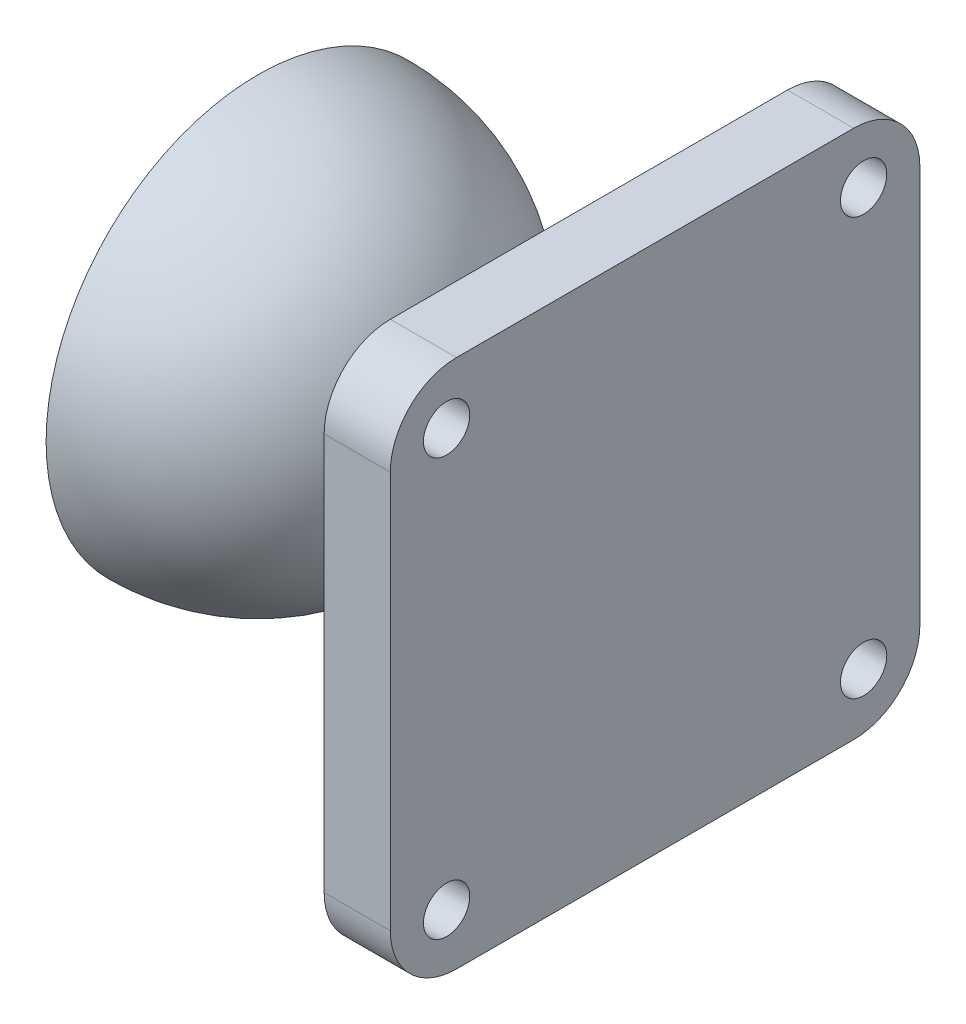
ISO-10303-21;
HEADER;
FILE_DESCRIPTION(('STEP AP214'),'2;1');
FILE_NAME('part.step','',(''),(''),'','','');
FILE_SCHEMA(('AUTOMOTIVE_DESIGN { 1 0 10303 214 1 1 1 1 }'));
ENDSEC;
DATA;
#1=APPLICATION_CONTEXT('core data for automotive mechanical design processes');
#2=APPLICATION_PROTOCOL_DEFINITION('international standard','automotive_design',2000,#1);
#3=PRODUCT_CONTEXT('',#1,'mechanical');
#4=PRODUCT('Part','Part','',(#3));
#5=PRODUCT_RELATED_PRODUCT_CATEGORY('part','',(#4));
#6=PRODUCT_DEFINITION_FORMATION('','',#4);
#7=PRODUCT_DEFINITION_CONTEXT('part definition',#1,'design');
#8=PRODUCT_DEFINITION('design','',#6,#7);
#9=PRODUCT_DEFINITION_SHAPE('','',#8);
#10=(LENGTH_UNIT() NAMED_UNIT(*) SI_UNIT(.MILLI.,.METRE.));
#11=(NAMED_UNIT(*) PLANE_ANGLE_UNIT() SI_UNIT($,.RADIAN.));
#12=(NAMED_UNIT(*) SI_UNIT($,.STERADIAN.) SOLID_ANGLE_UNIT());
#13=UNCERTAINTY_MEASURE_WITH_UNIT(LENGTH_MEASURE(1.E-05),#10,'distance_accuracy_value','');
#14=(GEOMETRIC_REPRESENTATION_CONTEXT(3) GLOBAL_UNCERTAINTY_ASSIGNED_CONTEXT((#13)) GLOBAL_UNIT_ASSIGNED_CONTEXT((#10,
#11,#12)) REPRESENTATION_CONTEXT('',''));
#15=CARTESIAN_POINT('',(0.,0.,0.));
#16=DIRECTION('',(0.,0.,1.));
#17=DIRECTION('',(1.,0.,0.));
#18=AXIS2_PLACEMENT_3D('',#15,#16,#17);
#19=CARTESIAN_POINT('',(0.,0.,0.));
#20=DIRECTION('',(-1.,0.,0.));
#21=DIRECTION('',(0.,1.,0.));
#22=AXIS2_PLACEMENT_3D('',#19,#20,#21);
#23=SPHERICAL_SURFACE('',#22,16.);
#24=CARTESIAN_POINT('',(0.,0.,0.));
#25=DIRECTION('',(-1.,0.,0.));
#26=DIRECTION('',(0.,0.,1.));
#27=AXIS2_PLACEMENT_3D('',#24,#25,#26);
#28=CIRCLE('',#27,16.);
#29=CARTESIAN_POINT('',(0.,0.,16.));
#30=VERTEX_POINT('',#29);
#31=EDGE_CURVE('E155',#30,#30,#28,.T.);
#32=ORIENTED_EDGE('',*,*,#31,.F.);
#33=EDGE_LOOP('',(#32));
#34=FACE_BOUND('',#33,.T.);
#35=CARTESIAN_POINT('',(14.1332940251026,0.,0.));
#36=DIRECTION('',(-1.,0.,0.));
#37=DIRECTION('',(0.,0.,1.));
#38=AXIS2_PLACEMENT_3D('',#35,#36,#37);
#39=CIRCLE('',#38,7.5);
#40=CARTESIAN_POINT('',(14.1332940251026,0.,-7.5));
#41=VERTEX_POINT('',#40);
#42=EDGE_CURVE('E158',#41,#41,#39,.F.);
#43=ORIENTED_EDGE('',*,*,#42,.F.);
#44=EDGE_LOOP('',(#43));
#45=FACE_BOUND('',#44,.T.);
#46=ADVANCED_FACE('F47',(#34,#45),#23,.T.);
#47=CARTESIAN_POINT('',(0.,15.,0.));
#48=DIRECTION('',(-1.,0.,0.));
#49=DIRECTION('',(0.,0.,1.));
#50=AXIS2_PLACEMENT_3D('',#47,#48,#49);
#51=PLANE('',#50);
#52=ORIENTED_EDGE('',*,*,#31,.T.);
#53=EDGE_LOOP('',(#52));
#54=FACE_BOUND('',#53,.T.);
#55=CARTESIAN_POINT('',(0.,0.,0.));
#56=DIRECTION('',(-1.,0.,0.));
#57=DIRECTION('',(0.,0.,1.));
#58=AXIS2_PLACEMENT_3D('',#55,#56,#57);
#59=CIRCLE('',#58,15.);
#60=CARTESIAN_POINT('',(0.,0.,15.));
#61=VERTEX_POINT('',#60);
#62=EDGE_CURVE('E151',#61,#61,#59,.T.);
#63=ORIENTED_EDGE('',*,*,#62,.F.);
#64=EDGE_LOOP('',(#63));
#65=FACE_BOUND('',#64,.T.);
#66=ADVANCED_FACE('F252',(#54,#65),#51,.T.);
#67=CARTESIAN_POINT('',(0.,0.,0.));
#68=DIRECTION('',(-1.,0.,0.));
#69=DIRECTION('',(0.,1.,0.));
#70=AXIS2_PLACEMENT_3D('',#67,#68,#69);
#71=SPHERICAL_SURFACE('',#70,15.);
#72=ORIENTED_EDGE('',*,*,#62,.T.);
#73=EDGE_LOOP('',(#72));
#74=FACE_BOUND('',#73,.T.);
#75=ADVANCED_FACE('F260',(#74),#71,.F.);
#76=CARTESIAN_POINT('',(-16.001,0.,0.));
#77=DIRECTION('',(1.,0.,0.));
#78=DIRECTION('',(0.,0.,-1.));
#79=AXIS2_PLACEMENT_3D('',#76,#77,#78);
#80=CYLINDRICAL_SURFACE('',#79,7.5);
#81=CARTESIAN_POINT('',(25.,0.,0.));
#82=DIRECTION('',(-1.,0.,0.));
#83=DIRECTION('',(0.,0.,1.));
#84=AXIS2_PLACEMENT_3D('',#81,#82,#83);
#85=CIRCLE('',#84,7.5);
#86=CARTESIAN_POINT('',(25.,0.,-7.5));
#87=VERTEX_POINT('',#86);
#88=EDGE_CURVE('E148',#87,#87,#85,.T.);
#89=CARTESIAN_POINT('',(25.,0.,-7.5));
#90=CARTESIAN_POINT('',(24.8868051460948,0.,-7.5));
#91=CARTESIAN_POINT('',(24.7736102921896,0.,-7.5));
#92=CARTESIAN_POINT('',(24.5472205843793,0.,-7.5));
#93=CARTESIAN_POINT('',(24.4340257304741,0.,-7.5));
#94=CARTESIAN_POINT('',(24.2076360226637,0.,-7.5));
#95=CARTESIAN_POINT('',(24.0944411687585,0.,-7.5));
#96=CARTESIAN_POINT('',(23.8680514609482,0.,-7.5));
#97=CARTESIAN_POINT('',(23.754856607043,0.,-7.5));
#98=CARTESIAN_POINT('',(23.5284668992326,0.,-7.5));
#99=CARTESIAN_POINT('',(23.4152720453275,0.,-7.5));
#100=CARTESIAN_POINT('',(23.1888823375171,0.,-7.5));
#101=CARTESIAN_POINT('',(23.0756874836119,0.,-7.5));
#102=CARTESIAN_POINT('',(22.8492977758015,0.,-7.5));
#103=CARTESIAN_POINT('',(22.7361029218964,0.,-7.5));
#104=CARTESIAN_POINT('',(22.509713214086,0.,-7.5));
#105=CARTESIAN_POINT('',(22.3965183601808,0.,-7.5));
#106=CARTESIAN_POINT('',(22.1701286523705,0.,-7.5));
#107=CARTESIAN_POINT('',(22.0569337984653,0.,-7.5));
#108=CARTESIAN_POINT('',(21.8305440906549,0.,-7.5));
#109=CARTESIAN_POINT('',(21.7173492367497,0.,-7.5));
#110=CARTESIAN_POINT('',(21.4909595289394,0.,-7.5));
#111=CARTESIAN_POINT('',(21.3777646750342,0.,-7.5));
#112=CARTESIAN_POINT('',(21.1513749672238,0.,-7.5));
#113=CARTESIAN_POINT('',(21.0381801133186,0.,-7.5));
#114=CARTESIAN_POINT('',(20.8117904055083,0.,-7.5));
#115=CARTESIAN_POINT('',(20.6985955516031,0.,-7.5));
#116=CARTESIAN_POINT('',(20.4722058437927,0.,-7.5));
#117=CARTESIAN_POINT('',(20.3590109898876,0.,-7.5));
#118=CARTESIAN_POINT('',(20.1326212820772,0.,-7.5));
#119=CARTESIAN_POINT('',(20.019426428172,0.,-7.5));
#120=CARTESIAN_POINT('',(19.7930367203616,0.,-7.5));
#121=CARTESIAN_POINT('',(19.6798418664565,0.,-7.5));
#122=CARTESIAN_POINT('',(19.4534521586461,0.,-7.5));
#123=CARTESIAN_POINT('',(19.3402573047409,0.,-7.5));
#124=CARTESIAN_POINT('',(19.1138675969306,0.,-7.5));
#125=CARTESIAN_POINT('',(19.0006727430254,0.,-7.5));
#126=CARTESIAN_POINT('',(18.774283035215,0.,-7.5));
#127=CARTESIAN_POINT('',(18.6610881813098,0.,-7.5));
#128=CARTESIAN_POINT('',(18.4346984734995,0.,-7.5));
#129=CARTESIAN_POINT('',(18.3215036195943,0.,-7.5));
#130=CARTESIAN_POINT('',(18.0951139117839,0.,-7.5));
#131=CARTESIAN_POINT('',(17.9819190578787,0.,-7.5));
#132=CARTESIAN_POINT('',(17.7555293500684,0.,-7.5));
#133=CARTESIAN_POINT('',(17.6423344961632,0.,-7.5));
#134=CARTESIAN_POINT('',(17.4159447883528,0.,-7.5));
#135=CARTESIAN_POINT('',(17.3027499344476,0.,-7.5));
#136=CARTESIAN_POINT('',(17.0763602266373,0.,-7.5));
#137=CARTESIAN_POINT('',(16.9631653727321,0.,-7.5));
#138=CARTESIAN_POINT('',(16.7367756649217,0.,-7.5));
#139=CARTESIAN_POINT('',(16.6235808110166,0.,-7.5));
#140=CARTESIAN_POINT('',(16.3971911032062,0.,-7.5));
#141=CARTESIAN_POINT('',(16.283996249301,0.,-7.5));
#142=CARTESIAN_POINT('',(16.0576065414906,0.,-7.5));
#143=CARTESIAN_POINT('',(15.9444116875855,0.,-7.5));
#144=CARTESIAN_POINT('',(15.7180219797751,0.,-7.5));
#145=CARTESIAN_POINT('',(15.6048271258699,0.,-7.5));
#146=CARTESIAN_POINT('',(15.3784374180596,0.,-7.5));
#147=CARTESIAN_POINT('',(15.2652425641544,0.,-7.5));
#148=CARTESIAN_POINT('',(15.038852856344,0.,-7.5));
#149=CARTESIAN_POINT('',(14.9256580024388,0.,-7.5));
#150=CARTESIAN_POINT('',(14.6992682946285,0.,-7.5));
#151=CARTESIAN_POINT('',(14.5860734407233,0.,-7.5));
#152=CARTESIAN_POINT('',(14.3596837329129,0.,-7.5));
#153=CARTESIAN_POINT('',(14.2464888790077,0.,-7.5));
#154=CARTESIAN_POINT('',(14.1332940251026,0.,-7.5));
#155=B_SPLINE_CURVE_WITH_KNOTS('',3,(#89,#90,#91,#92,#93,#94,#95,#96,#97,#98,#99,#100,#101,#102,
#103,#104,#105,#106,#107,#108,#109,#110,#111,#112,#113,#114,#115,#116,#117,#118,#119,#120,#121,
#122,#123,#124,#125,#126,#127,#128,#129,#130,#131,#132,#133,#134,#135,#136,#137,#138,#139,#140,
#141,#142,#143,#144,#145,#146,#147,#148,#149,#150,#151,#152,#153,#154),.UNSPECIFIED.,.F.,.F.,(4,
2,2,2,2,2,2,2,2,2,2,2,2,2,2,2,2,2,2,2,2,2,2,2,2,2,2,2,2,2,2,2,4),(0.,0.339584561715546,
0.679169123431092,1.01875368514664,1.35833824686218,1.69792280857772,2.03750737029327,
2.37709193200882,2.71667649372436,3.05626105543991,3.39584561715545,3.735430178871,
4.07501474058654,4.41459930230208,4.75418386401763,5.09376842573318,5.43335298744872,
5.77293754916427,6.11252211087981,6.45210667259536,6.79169123431091,7.13127579602645,
7.47086035774199,7.81044491945754,8.15002948117308,8.48961404288863,8.82919860460418,
9.16878316631972,9.50836772803526,9.84795228975081,10.1875368514663,10.5271214131819,
10.8667059748974),.UNSPECIFIED.);
#156=EDGE_CURVE('BSEAM355',#87,#41,#155,.T.);
#157=ORIENTED_EDGE('',*,*,#88,.T.);
#158=ORIENTED_EDGE('',*,*,#42,.T.);
#159=ORIENTED_EDGE('',*,*,#156,.T.);
#160=ORIENTED_EDGE('',*,*,#156,.F.);
#161=EDGE_LOOP('',(#157,#159,#158,#160));
#162=FACE_BOUND('',#161,.T.);
#163=ADVANCED_FACE('F355',(#162),#80,.T.);
#164=CARTESIAN_POINT('',(30.,-20.,-20.));
#165=DIRECTION('',(0.,0.,1.));
#166=DIRECTION('',(1.,0.,0.));
#167=AXIS2_PLACEMENT_3D('',#164,#165,#166);
#168=PLANE('',#167);
#169=DIRECTION('',(0.,1.,0.));
#170=VECTOR('',#169,1.);
#171=CARTESIAN_POINT('',(30.,-20.,-20.));
#172=LINE('',#171,#170);
#173=CARTESIAN_POINT('',(30.,-15.,-20.));
#174=VERTEX_POINT('',#173);
#175=CARTESIAN_POINT('',(30.,15.,-20.));
#176=VERTEX_POINT('',#175);
#177=EDGE_CURVE('E142',#174,#176,#172,.T.);
#178=ORIENTED_EDGE('',*,*,#177,.F.);
#179=DIRECTION('',(-1.,0.,0.));
#180=VECTOR('',#179,1.);
#181=CARTESIAN_POINT('',(30.,-15.,-20.));
#182=LINE('',#181,#180);
#183=CARTESIAN_POINT('',(25.,-15.,-20.));
#184=VERTEX_POINT('',#183);
#185=EDGE_CURVE('E11',#174,#184,#182,.T.);
#186=ORIENTED_EDGE('',*,*,#185,.T.);
#187=DIRECTION('',(0.,1.,0.));
#188=VECTOR('',#187,1.);
#189=CARTESIAN_POINT('',(25.,-20.,-20.));
#190=LINE('',#189,#188);
#191=CARTESIAN_POINT('',(25.,15.,-20.));
#192=VERTEX_POINT('',#191);
#193=EDGE_CURVE('E144',#184,#192,#190,.T.);
#194=ORIENTED_EDGE('',*,*,#193,.T.);
#195=DIRECTION('',(-1.,0.,0.));
#196=VECTOR('',#195,1.);
#197=CARTESIAN_POINT('',(30.,15.,-20.));
#198=LINE('',#197,#196);
#199=EDGE_CURVE('E55',#192,#176,#198,.F.);
#200=ORIENTED_EDGE('',*,*,#199,.T.);
#201=EDGE_LOOP('',(#178,#186,#194,#200));
#202=FACE_BOUND('',#201,.T.);
#203=ADVANCED_FACE('F184',(#202),#168,.F.);
#204=CARTESIAN_POINT('',(30.,20.,20.));
#205=DIRECTION('',(0.,-1.,0.));
#206=DIRECTION('',(0.,0.,-1.));
#207=AXIS2_PLACEMENT_3D('',#204,#205,#206);
#208=PLANE('',#207);
#209=DIRECTION('',(0.,0.,1.));
#210=VECTOR('',#209,1.);
#211=CARTESIAN_POINT('',(25.,20.,20.));
#212=LINE('',#211,#210);
#213=CARTESIAN_POINT('',(25.,20.,-15.));
#214=VERTEX_POINT('',#213);
#215=CARTESIAN_POINT('',(25.,20.,15.));
#216=VERTEX_POINT('',#215);
#217=EDGE_CURVE('E140',#214,#216,#212,.T.);
#218=ORIENTED_EDGE('',*,*,#217,.T.);
#219=DIRECTION('',(-1.,0.,0.));
#220=VECTOR('',#219,1.);
#221=CARTESIAN_POINT('',(30.,20.,15.));
#222=LINE('',#221,#220);
#223=CARTESIAN_POINT('',(30.,20.,15.));
#224=VERTEX_POINT('',#223);
#225=EDGE_CURVE('E119',#216,#224,#222,.F.);
#226=ORIENTED_EDGE('',*,*,#225,.T.);
#227=DIRECTION('',(0.,0.,1.));
#228=VECTOR('',#227,1.);
#229=CARTESIAN_POINT('',(30.,20.,20.));
#230=LINE('',#229,#228);
#231=CARTESIAN_POINT('',(30.,20.,-15.));
#232=VERTEX_POINT('',#231);
#233=EDGE_CURVE('E193',#232,#224,#230,.T.);
#234=ORIENTED_EDGE('',*,*,#233,.F.);
#235=DIRECTION('',(-1.,0.,0.));
#236=VECTOR('',#235,1.);
#237=CARTESIAN_POINT('',(30.,20.,-15.));
#238=LINE('',#237,#236);
#239=EDGE_CURVE('E124',#232,#214,#238,.T.);
#240=ORIENTED_EDGE('',*,*,#239,.T.);
#241=EDGE_LOOP('',(#218,#226,#234,#240));
#242=FACE_BOUND('',#241,.T.);
#243=ADVANCED_FACE('F197',(#242),#208,.F.);
#244=CARTESIAN_POINT('',(30.,-20.,20.));
#245=DIRECTION('',(0.,0.,-1.));
#246=DIRECTION('',(-1.,0.,0.));
#247=AXIS2_PLACEMENT_3D('',#244,#245,#246);
#248=PLANE('',#247);
#249=DIRECTION('',(0.,-1.,0.));
#250=VECTOR('',#249,1.);
#251=CARTESIAN_POINT('',(30.,-20.,20.));
#252=LINE('',#251,#250);
#253=CARTESIAN_POINT('',(30.,15.,20.));
#254=VERTEX_POINT('',#253);
#255=CARTESIAN_POINT('',(30.,-15.,20.));
#256=VERTEX_POINT('',#255);
#257=EDGE_CURVE('E133',#254,#256,#252,.T.);
#258=ORIENTED_EDGE('',*,*,#257,.F.);
#259=DIRECTION('',(-1.,0.,0.));
#260=VECTOR('',#259,1.);
#261=CARTESIAN_POINT('',(30.,15.,20.));
#262=LINE('',#261,#260);
#263=CARTESIAN_POINT('',(25.,15.,20.));
#264=VERTEX_POINT('',#263);
#265=EDGE_CURVE('E118',#254,#264,#262,.T.);
#266=ORIENTED_EDGE('',*,*,#265,.T.);
#267=DIRECTION('',(0.,-1.,0.));
#268=VECTOR('',#267,1.);
#269=CARTESIAN_POINT('',(25.,-20.,20.));
#270=LINE('',#269,#268);
#271=CARTESIAN_POINT('',(25.,-15.,20.));
#272=VERTEX_POINT('',#271);
#273=EDGE_CURVE('E131',#264,#272,#270,.T.);
#274=ORIENTED_EDGE('',*,*,#273,.T.);
#275=DIRECTION('',(-1.,0.,0.));
#276=VECTOR('',#275,1.);
#277=CARTESIAN_POINT('',(30.,-15.,20.));
#278=LINE('',#277,#276);
#279=EDGE_CURVE('E135',#272,#256,#278,.F.);
#280=ORIENTED_EDGE('',*,*,#279,.T.);
#281=EDGE_LOOP('',(#258,#266,#274,#280));
#282=FACE_BOUND('',#281,.T.);
#283=ADVANCED_FACE('F130',(#282),#248,.F.);
#284=CARTESIAN_POINT('',(30.,-20.,20.));
#285=DIRECTION('',(0.,1.,0.));
#286=DIRECTION('',(0.,0.,1.));
#287=AXIS2_PLACEMENT_3D('',#284,#285,#286);
#288=PLANE('',#287);
#289=DIRECTION('',(0.,0.,-1.));
#290=VECTOR('',#289,1.);
#291=CARTESIAN_POINT('',(30.,-20.,20.));
#292=LINE('',#291,#290);
#293=CARTESIAN_POINT('',(30.,-20.,15.));
#294=VERTEX_POINT('',#293);
#295=CARTESIAN_POINT('',(30.,-20.,-15.));
#296=VERTEX_POINT('',#295);
#297=EDGE_CURVE('E152',#294,#296,#292,.T.);
#298=ORIENTED_EDGE('',*,*,#297,.F.);
#299=DIRECTION('',(-1.,0.,0.));
#300=VECTOR('',#299,1.);
#301=CARTESIAN_POINT('',(30.,-20.,15.));
#302=LINE('',#301,#300);
#303=CARTESIAN_POINT('',(25.,-20.,15.));
#304=VERTEX_POINT('',#303);
#305=EDGE_CURVE('E177',#294,#304,#302,.T.);
#306=ORIENTED_EDGE('',*,*,#305,.T.);
#307=DIRECTION('',(0.,0.,-1.));
#308=VECTOR('',#307,1.);
#309=CARTESIAN_POINT('',(25.,-20.,20.));
#310=LINE('',#309,#308);
#311=CARTESIAN_POINT('',(25.,-20.,-15.));
#312=VERTEX_POINT('',#311);
#313=EDGE_CURVE('E139',#304,#312,#310,.T.);
#314=ORIENTED_EDGE('',*,*,#313,.T.);
#315=DIRECTION('',(-1.,0.,0.));
#316=VECTOR('',#315,1.);
#317=CARTESIAN_POINT('',(30.,-20.,-15.));
#318=LINE('',#317,#316);
#319=EDGE_CURVE('E62',#312,#296,#318,.F.);
#320=ORIENTED_EDGE('',*,*,#319,.T.);
#321=EDGE_LOOP('',(#298,#306,#314,#320));
#322=FACE_BOUND('',#321,.T.);
#323=ADVANCED_FACE('F231',(#322),#288,.F.);
#324=CARTESIAN_POINT('',(30.,0.,0.));
#325=DIRECTION('',(-1.,0.,0.));
#326=DIRECTION('',(0.,0.,1.));
#327=AXIS2_PLACEMENT_3D('',#324,#325,#326);
#328=PLANE('',#327);
#329=CARTESIAN_POINT('',(30.,-15.75,15.75));
#330=DIRECTION('',(1.,0.,0.));
#331=DIRECTION('',(0.,0.,1.));
#332=AXIS2_PLACEMENT_3D('',#329,#330,#331);
#333=CIRCLE('',#332,1.74999999999999);
#334=CARTESIAN_POINT('',(30.,-15.75,17.5));
#335=VERTEX_POINT('',#334);
#336=EDGE_CURVE('E212',#335,#335,#333,.T.);
#337=ORIENTED_EDGE('',*,*,#336,.F.);
#338=EDGE_LOOP('',(#337));
#339=FACE_BOUND('',#338,.T.);
#340=CARTESIAN_POINT('',(30.,-15.75,-15.75));
#341=DIRECTION('',(1.,0.,0.));
#342=DIRECTION('',(0.,0.,-1.));
#343=AXIS2_PLACEMENT_3D('',#340,#341,#342);
#344=CIRCLE('',#343,1.75);
#345=CARTESIAN_POINT('',(30.,-15.75,-17.5));
#346=VERTEX_POINT('',#345);
#347=EDGE_CURVE('E218',#346,#346,#344,.T.);
#348=ORIENTED_EDGE('',*,*,#347,.F.);
#349=EDGE_LOOP('',(#348));
#350=FACE_BOUND('',#349,.T.);
#351=CARTESIAN_POINT('',(30.,15.75,-15.75));
#352=DIRECTION('',(1.,0.,0.));
#353=DIRECTION('',(0.,0.,1.));
#354=AXIS2_PLACEMENT_3D('',#351,#352,#353);
#355=CIRCLE('',#354,1.75);
#356=CARTESIAN_POINT('',(30.,15.75,-14.));
#357=VERTEX_POINT('',#356);
#358=EDGE_CURVE('E207',#357,#357,#355,.T.);
#359=ORIENTED_EDGE('',*,*,#358,.F.);
#360=EDGE_LOOP('',(#359));
#361=FACE_BOUND('',#360,.T.);
#362=CARTESIAN_POINT('',(30.,15.75,15.75));
#363=DIRECTION('',(1.,0.,0.));
#364=DIRECTION('',(0.,0.,-1.));
#365=AXIS2_PLACEMENT_3D('',#362,#363,#364);
#366=CIRCLE('',#365,1.75);
#367=CARTESIAN_POINT('',(30.,15.75,14.));
#368=VERTEX_POINT('',#367);
#369=EDGE_CURVE('E200',#368,#368,#366,.T.);
#370=ORIENTED_EDGE('',*,*,#369,.F.);
#371=EDGE_LOOP('',(#370));
#372=FACE_BOUND('',#371,.T.);
#373=ORIENTED_EDGE('',*,*,#233,.T.);
#374=CARTESIAN_POINT('',(30.,15.,15.));
#375=DIRECTION('',(-1.,0.,0.));
#376=DIRECTION('',(0.,0.,1.));
#377=AXIS2_PLACEMENT_3D('',#374,#375,#376);
#378=CIRCLE('',#377,5.);
#379=EDGE_CURVE('E174',#224,#254,#378,.F.);
#380=ORIENTED_EDGE('',*,*,#379,.T.);
#381=ORIENTED_EDGE('',*,*,#257,.T.);
#382=CARTESIAN_POINT('',(30.,-15.,15.));
#383=DIRECTION('',(-1.,0.,0.));
#384=DIRECTION('',(0.,0.,1.));
#385=AXIS2_PLACEMENT_3D('',#382,#383,#384);
#386=CIRCLE('',#385,5.);
#387=EDGE_CURVE('E69',#256,#294,#386,.F.);
#388=ORIENTED_EDGE('',*,*,#387,.T.);
#389=ORIENTED_EDGE('',*,*,#297,.T.);
#390=CARTESIAN_POINT('',(30.,-15.,-15.));
#391=DIRECTION('',(-1.,0.,0.));
#392=DIRECTION('',(0.,0.,1.));
#393=AXIS2_PLACEMENT_3D('',#390,#391,#392);
#394=CIRCLE('',#393,5.);
#395=EDGE_CURVE('E171',#296,#174,#394,.F.);
#396=ORIENTED_EDGE('',*,*,#395,.T.);
#397=ORIENTED_EDGE('',*,*,#177,.T.);
#398=CARTESIAN_POINT('',(30.,15.,-15.));
#399=DIRECTION('',(-1.,0.,0.));
#400=DIRECTION('',(0.,0.,1.));
#401=AXIS2_PLACEMENT_3D('',#398,#399,#400);
#402=CIRCLE('',#401,5.);
#403=EDGE_CURVE('E169',#176,#232,#402,.F.);
#404=ORIENTED_EDGE('',*,*,#403,.T.);
#405=EDGE_LOOP('',(#373,#380,#381,#388,#389,#396,#397,#404));
#406=FACE_BOUND('',#405,.T.);
#407=ADVANCED_FACE('F190',(#339,#350,#361,#372,#406),#328,.F.);
#408=CARTESIAN_POINT('',(25.,0.,0.));
#409=DIRECTION('',(-1.,0.,0.));
#410=DIRECTION('',(0.,0.,1.));
#411=AXIS2_PLACEMENT_3D('',#408,#409,#410);
#412=PLANE('',#411);
#413=CARTESIAN_POINT('',(25.,-15.75,15.75));
#414=DIRECTION('',(1.,0.,0.));
#415=DIRECTION('',(0.,0.,1.));
#416=AXIS2_PLACEMENT_3D('',#413,#414,#415);
#417=CIRCLE('',#416,1.74999999999999);
#418=CARTESIAN_POINT('',(25.,-15.75,17.5));
#419=VERTEX_POINT('',#418);
#420=EDGE_CURVE('E209',#419,#419,#417,.T.);
#421=ORIENTED_EDGE('',*,*,#420,.T.);
#422=EDGE_LOOP('',(#421));
#423=FACE_BOUND('',#422,.T.);
#424=CARTESIAN_POINT('',(25.,-15.75,-15.75));
#425=DIRECTION('',(1.,0.,0.));
#426=DIRECTION('',(0.,0.,-1.));
#427=AXIS2_PLACEMENT_3D('',#424,#425,#426);
#428=CIRCLE('',#427,1.75);
#429=CARTESIAN_POINT('',(25.,-15.75,-17.5));
#430=VERTEX_POINT('',#429);
#431=EDGE_CURVE('E215',#430,#430,#428,.T.);
#432=ORIENTED_EDGE('',*,*,#431,.T.);
#433=EDGE_LOOP('',(#432));
#434=FACE_BOUND('',#433,.T.);
#435=CARTESIAN_POINT('',(25.,15.75,-15.75));
#436=DIRECTION('',(1.,0.,0.));
#437=DIRECTION('',(0.,0.,1.));
#438=AXIS2_PLACEMENT_3D('',#435,#436,#437);
#439=CIRCLE('',#438,1.75);
#440=CARTESIAN_POINT('',(25.,15.75,-14.));
#441=VERTEX_POINT('',#440);
#442=EDGE_CURVE('E221',#441,#441,#439,.T.);
#443=ORIENTED_EDGE('',*,*,#442,.T.);
#444=EDGE_LOOP('',(#443));
#445=FACE_BOUND('',#444,.T.);
#446=CARTESIAN_POINT('',(25.,15.75,15.75));
#447=DIRECTION('',(1.,0.,0.));
#448=DIRECTION('',(0.,0.,-1.));
#449=AXIS2_PLACEMENT_3D('',#446,#447,#448);
#450=CIRCLE('',#449,1.75);
#451=CARTESIAN_POINT('',(25.,15.75,14.));
#452=VERTEX_POINT('',#451);
#453=EDGE_CURVE('E198',#452,#452,#450,.T.);
#454=ORIENTED_EDGE('',*,*,#453,.T.);
#455=EDGE_LOOP('',(#454));
#456=FACE_BOUND('',#455,.T.);
#457=ORIENTED_EDGE('',*,*,#88,.F.);
#458=EDGE_LOOP('',(#457));
#459=FACE_BOUND('',#458,.T.);
#460=ORIENTED_EDGE('',*,*,#273,.F.);
#461=CARTESIAN_POINT('',(25.,15.,15.));
#462=DIRECTION('',(-1.,0.,0.));
#463=DIRECTION('',(0.,0.,1.));
#464=AXIS2_PLACEMENT_3D('',#461,#462,#463);
#465=CIRCLE('',#464,5.);
#466=EDGE_CURVE('E114',#264,#216,#465,.T.);
#467=ORIENTED_EDGE('',*,*,#466,.T.);
#468=ORIENTED_EDGE('',*,*,#217,.F.);
#469=CARTESIAN_POINT('',(25.,15.,-15.));
#470=DIRECTION('',(-1.,0.,0.));
#471=DIRECTION('',(0.,0.,1.));
#472=AXIS2_PLACEMENT_3D('',#469,#470,#471);
#473=CIRCLE('',#472,5.);
#474=EDGE_CURVE('E134',#214,#192,#473,.T.);
#475=ORIENTED_EDGE('',*,*,#474,.T.);
#476=ORIENTED_EDGE('',*,*,#193,.F.);
#477=CARTESIAN_POINT('',(25.,-15.,-15.));
#478=DIRECTION('',(-1.,0.,0.));
#479=DIRECTION('',(0.,0.,1.));
#480=AXIS2_PLACEMENT_3D('',#477,#478,#479);
#481=CIRCLE('',#480,5.);
#482=EDGE_CURVE('E163',#184,#312,#481,.T.);
#483=ORIENTED_EDGE('',*,*,#482,.T.);
#484=ORIENTED_EDGE('',*,*,#313,.F.);
#485=CARTESIAN_POINT('',(25.,-15.,15.));
#486=DIRECTION('',(-1.,0.,0.));
#487=DIRECTION('',(0.,0.,1.));
#488=AXIS2_PLACEMENT_3D('',#485,#486,#487);
#489=CIRCLE('',#488,5.);
#490=EDGE_CURVE('E125',#304,#272,#489,.T.);
#491=ORIENTED_EDGE('',*,*,#490,.T.);
#492=EDGE_LOOP('',(#460,#467,#468,#475,#476,#483,#484,#491));
#493=FACE_BOUND('',#492,.T.);
#494=ADVANCED_FACE('F137',(#423,#434,#445,#456,#459,#493),#412,.T.);
#495=CARTESIAN_POINT('',(30.,15.,15.));
#496=DIRECTION('',(-1.,0.,0.));
#497=DIRECTION('',(0.,0.,1.));
#498=AXIS2_PLACEMENT_3D('',#495,#496,#497);
#499=CYLINDRICAL_SURFACE('',#498,5.);
#500=ORIENTED_EDGE('',*,*,#379,.F.);
#501=ORIENTED_EDGE('',*,*,#225,.F.);
#502=ORIENTED_EDGE('',*,*,#466,.F.);
#503=ORIENTED_EDGE('',*,*,#265,.F.);
#504=EDGE_LOOP('',(#500,#501,#502,#503));
#505=FACE_BOUND('',#504,.T.);
#506=ADVANCED_FACE('F117',(#505),#499,.T.);
#507=CARTESIAN_POINT('',(30.,-15.,15.));
#508=DIRECTION('',(-1.,0.,0.));
#509=DIRECTION('',(0.,0.,1.));
#510=AXIS2_PLACEMENT_3D('',#507,#508,#509);
#511=CYLINDRICAL_SURFACE('',#510,5.);
#512=ORIENTED_EDGE('',*,*,#387,.F.);
#513=ORIENTED_EDGE('',*,*,#279,.F.);
#514=ORIENTED_EDGE('',*,*,#490,.F.);
#515=ORIENTED_EDGE('',*,*,#305,.F.);
#516=EDGE_LOOP('',(#512,#513,#514,#515));
#517=FACE_BOUND('',#516,.T.);
#518=ADVANCED_FACE('F269',(#517),#511,.T.);
#519=CARTESIAN_POINT('',(30.,-15.,-15.));
#520=DIRECTION('',(-1.,0.,0.));
#521=DIRECTION('',(0.,0.,1.));
#522=AXIS2_PLACEMENT_3D('',#519,#520,#521);
#523=CYLINDRICAL_SURFACE('',#522,5.);
#524=ORIENTED_EDGE('',*,*,#395,.F.);
#525=ORIENTED_EDGE('',*,*,#319,.F.);
#526=ORIENTED_EDGE('',*,*,#482,.F.);
#527=ORIENTED_EDGE('',*,*,#185,.F.);
#528=EDGE_LOOP('',(#524,#525,#526,#527));
#529=FACE_BOUND('',#528,.T.);
#530=ADVANCED_FACE('F248',(#529),#523,.T.);
#531=CARTESIAN_POINT('',(30.,15.,-15.));
#532=DIRECTION('',(-1.,0.,0.));
#533=DIRECTION('',(0.,0.,1.));
#534=AXIS2_PLACEMENT_3D('',#531,#532,#533);
#535=CYLINDRICAL_SURFACE('',#534,5.);
#536=ORIENTED_EDGE('',*,*,#403,.F.);
#537=ORIENTED_EDGE('',*,*,#199,.F.);
#538=ORIENTED_EDGE('',*,*,#474,.F.);
#539=ORIENTED_EDGE('',*,*,#239,.F.);
#540=EDGE_LOOP('',(#536,#537,#538,#539));
#541=FACE_BOUND('',#540,.T.);
#542=ADVANCED_FACE('F49',(#541),#535,.T.);
#543=CARTESIAN_POINT('',(25.,15.75,15.75));
#544=DIRECTION('',(1.,0.,0.));
#545=DIRECTION('',(0.,0.,-1.));
#546=AXIS2_PLACEMENT_3D('',#543,#544,#545);
#547=CYLINDRICAL_SURFACE('',#546,1.75);
#548=ORIENTED_EDGE('',*,*,#453,.F.);
#549=EDGE_LOOP('',(#548));
#550=FACE_BOUND('',#549,.T.);
#551=ORIENTED_EDGE('',*,*,#369,.T.);
#552=EDGE_LOOP('',(#551));
#553=FACE_BOUND('',#552,.T.);
#554=ADVANCED_FACE('F236',(#550,#553),#547,.F.);
#555=CARTESIAN_POINT('',(25.,15.75,-15.75));
#556=DIRECTION('',(1.,0.,0.));
#557=DIRECTION('',(0.,0.,-1.));
#558=AXIS2_PLACEMENT_3D('',#555,#556,#557);
#559=CYLINDRICAL_SURFACE('',#558,1.75);
#560=ORIENTED_EDGE('',*,*,#442,.F.);
#561=EDGE_LOOP('',(#560));
#562=FACE_BOUND('',#561,.T.);
#563=ORIENTED_EDGE('',*,*,#358,.T.);
#564=EDGE_LOOP('',(#563));
#565=FACE_BOUND('',#564,.T.);
#566=ADVANCED_FACE('F227',(#562,#565),#559,.F.);
#567=CARTESIAN_POINT('',(25.,-15.75,-15.75));
#568=DIRECTION('',(1.,0.,0.));
#569=DIRECTION('',(0.,0.,-1.));
#570=AXIS2_PLACEMENT_3D('',#567,#568,#569);
#571=CYLINDRICAL_SURFACE('',#570,1.75);
#572=ORIENTED_EDGE('',*,*,#431,.F.);
#573=EDGE_LOOP('',(#572));
#574=FACE_BOUND('',#573,.T.);
#575=ORIENTED_EDGE('',*,*,#347,.T.);
#576=EDGE_LOOP('',(#575));
#577=FACE_BOUND('',#576,.T.);
#578=ADVANCED_FACE('F244',(#574,#577),#571,.F.);
#579=CARTESIAN_POINT('',(25.,-15.75,15.75));
#580=DIRECTION('',(1.,0.,0.));
#581=DIRECTION('',(0.,0.,-1.));
#582=AXIS2_PLACEMENT_3D('',#579,#580,#581);
#583=CYLINDRICAL_SURFACE('',#582,1.74999999999999);
#584=ORIENTED_EDGE('',*,*,#420,.F.);
#585=EDGE_LOOP('',(#584));
#586=FACE_BOUND('',#585,.T.);
#587=ORIENTED_EDGE('',*,*,#336,.T.);
#588=EDGE_LOOP('',(#587));
#589=FACE_BOUND('',#588,.T.);
#590=ADVANCED_FACE('F327',(#586,#589),#583,.F.);
#591=CLOSED_SHELL('',(#46,#66,#75,#163,#203,#243,#283,#323,#407,#494,#506,#518,#530,#542,#554,
#566,#578,#590));
#592=MANIFOLD_SOLID_BREP('B2',#591);
#593=ADVANCED_BREP_SHAPE_REPRESENTATION('',(#18,#592),#14);
#594=SHAPE_DEFINITION_REPRESENTATION(#9,#593);
ENDSEC;
END-ISO-10303-21;
